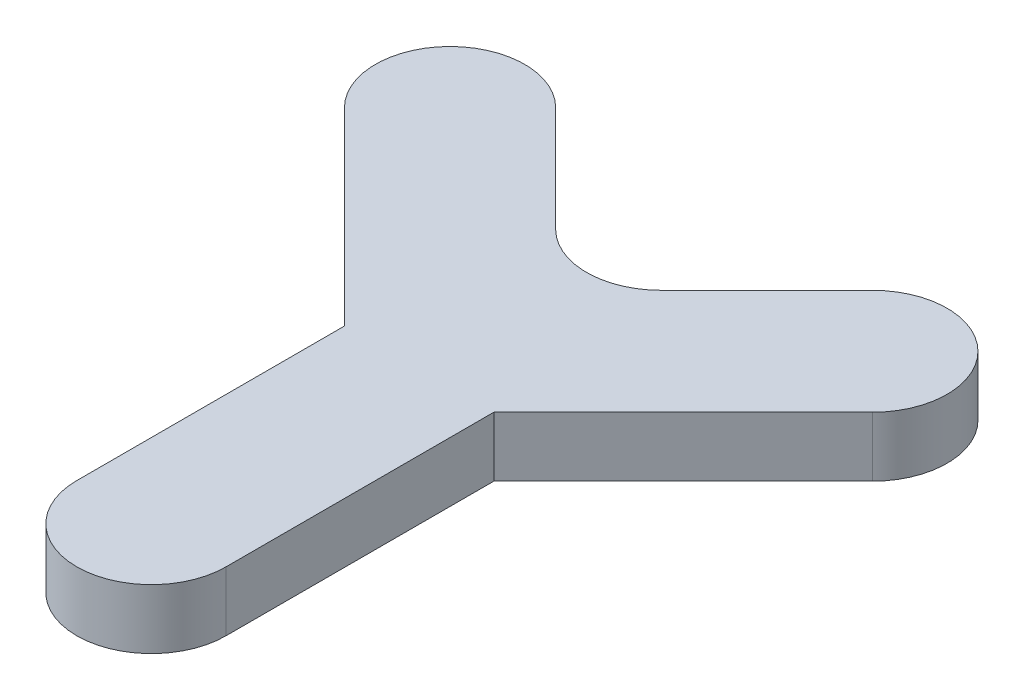
ISO-10303-21;
HEADER;
FILE_DESCRIPTION(('STEP AP214'),'2;1');
FILE_NAME('part.step','',(''),(''),'','','');
FILE_SCHEMA(('AUTOMOTIVE_DESIGN { 1 0 10303 214 1 1 1 1 }'));
ENDSEC;
DATA;
#1=APPLICATION_CONTEXT('core data for automotive mechanical design processes');
#2=APPLICATION_PROTOCOL_DEFINITION('international standard','automotive_design',2000,#1);
#3=PRODUCT_CONTEXT('',#1,'mechanical');
#4=PRODUCT('Part','Part','',(#3));
#5=PRODUCT_RELATED_PRODUCT_CATEGORY('part','',(#4));
#6=PRODUCT_DEFINITION_FORMATION('','',#4);
#7=PRODUCT_DEFINITION_CONTEXT('part definition',#1,'design');
#8=PRODUCT_DEFINITION('design','',#6,#7);
#9=PRODUCT_DEFINITION_SHAPE('','',#8);
#10=(LENGTH_UNIT() NAMED_UNIT(*) SI_UNIT(.MILLI.,.METRE.));
#11=(NAMED_UNIT(*) PLANE_ANGLE_UNIT() SI_UNIT($,.RADIAN.));
#12=(NAMED_UNIT(*) SI_UNIT($,.STERADIAN.) SOLID_ANGLE_UNIT());
#13=UNCERTAINTY_MEASURE_WITH_UNIT(LENGTH_MEASURE(1.E-05),#10,'distance_accuracy_value','');
#14=(GEOMETRIC_REPRESENTATION_CONTEXT(3) GLOBAL_UNCERTAINTY_ASSIGNED_CONTEXT((#13)) GLOBAL_UNIT_ASSIGNED_CONTEXT((#10,
#11,#12)) REPRESENTATION_CONTEXT('',''));
#15=CARTESIAN_POINT('',(0.,0.,0.));
#16=DIRECTION('',(0.,0.,1.));
#17=DIRECTION('',(1.,0.,0.));
#18=AXIS2_PLACEMENT_3D('',#15,#16,#17);
#19=CARTESIAN_POINT('',(0.,2.,-7.07106781186545));
#20=DIRECTION('',(0.,-1.,0.));
#21=DIRECTION('',(0.,0.,-1.));
#22=AXIS2_PLACEMENT_3D('',#19,#20,#21);
#23=CYLINDRICAL_SURFACE('',#22,2.5);
#24=CARTESIAN_POINT('',(0.,0.,-7.07106781186545));
#25=DIRECTION('',(0.,-1.,0.));
#26=DIRECTION('',(0.,0.,1.));
#27=AXIS2_PLACEMENT_3D('',#24,#25,#26);
#28=CIRCLE('',#27,2.5);
#29=CARTESIAN_POINT('',(1.76776695296642,0.,-5.30330085889907));
#30=VERTEX_POINT('',#29);
#31=CARTESIAN_POINT('',(-1.76776695296632,0.,-5.30330085889909));
#32=VERTEX_POINT('',#31);
#33=EDGE_CURVE('E152',#30,#32,#28,.T.);
#34=ORIENTED_EDGE('',*,*,#33,.T.);
#35=DIRECTION('',(0.,-1.,0.));
#36=VECTOR('',#35,1.);
#37=CARTESIAN_POINT('',(-1.76776695296632,2.,-5.30330085889909));
#38=LINE('',#37,#36);
#39=CARTESIAN_POINT('',(-1.76776695296632,2.,-5.30330085889909));
#40=VERTEX_POINT('',#39);
#41=EDGE_CURVE('E11',#40,#32,#38,.T.);
#42=ORIENTED_EDGE('',*,*,#41,.F.);
#43=CARTESIAN_POINT('',(0.,2.,-7.07106781186545));
#44=DIRECTION('',(0.,-1.,0.));
#45=DIRECTION('',(0.,0.,1.));
#46=AXIS2_PLACEMENT_3D('',#43,#44,#45);
#47=CIRCLE('',#46,2.5);
#48=CARTESIAN_POINT('',(1.76776695296642,2.,-5.30330085889907));
#49=VERTEX_POINT('',#48);
#50=EDGE_CURVE('E180',#49,#40,#47,.T.);
#51=ORIENTED_EDGE('',*,*,#50,.F.);
#52=DIRECTION('',(0.,-1.,0.));
#53=VECTOR('',#52,1.);
#54=CARTESIAN_POINT('',(1.76776695296642,2.,-5.30330085889907));
#55=LINE('',#54,#53);
#56=EDGE_CURVE('E148',#49,#30,#55,.T.);
#57=ORIENTED_EDGE('',*,*,#56,.T.);
#58=EDGE_LOOP('',(#34,#42,#51,#57));
#59=FACE_BOUND('',#58,.T.);
#60=ADVANCED_FACE('F39',(#59),#23,.F.);
#61=CARTESIAN_POINT('',(-5.30330085889906,2.,-8.83883476483187));
#62=DIRECTION('',(-0.707106781186551,0.,0.707106781186544));
#63=DIRECTION('',(0.707106781186544,0.,0.707106781186551));
#64=AXIS2_PLACEMENT_3D('',#61,#62,#63);
#65=PLANE('',#64);
#66=DIRECTION('',(-0.707106781186544,0.,-0.707106781186551));
#67=VECTOR('',#66,1.);
#68=CARTESIAN_POINT('',(-5.30330085889906,0.,-8.83883476483187));
#69=LINE('',#68,#67);
#70=CARTESIAN_POINT('',(-5.30330085889906,0.,-8.83883476483187));
#71=VERTEX_POINT('',#70);
#72=EDGE_CURVE('E156',#32,#71,#69,.T.);
#73=ORIENTED_EDGE('',*,*,#72,.T.);
#74=DIRECTION('',(0.,-1.,0.));
#75=VECTOR('',#74,1.);
#76=CARTESIAN_POINT('',(-5.30330085889906,2.,-8.83883476483187));
#77=LINE('',#76,#75);
#78=CARTESIAN_POINT('',(-5.30330085889906,2.,-8.83883476483187));
#79=VERTEX_POINT('',#78);
#80=EDGE_CURVE('E48',#79,#71,#77,.T.);
#81=ORIENTED_EDGE('',*,*,#80,.F.);
#82=DIRECTION('',(-0.707106781186544,0.,-0.707106781186551));
#83=VECTOR('',#82,1.);
#84=CARTESIAN_POINT('',(-5.30330085889906,2.,-8.83883476483187));
#85=LINE('',#84,#83);
#86=EDGE_CURVE('E105',#40,#79,#85,.T.);
#87=ORIENTED_EDGE('',*,*,#86,.F.);
#88=ORIENTED_EDGE('',*,*,#41,.T.);
#89=EDGE_LOOP('',(#73,#81,#87,#88));
#90=FACE_BOUND('',#89,.T.);
#91=ADVANCED_FACE('F244',(#90),#65,.F.);
#92=CARTESIAN_POINT('',(-7.07106781186544,2.,-7.07106781186551));
#93=DIRECTION('',(0.,-1.,0.));
#94=DIRECTION('',(0.,0.,-1.));
#95=AXIS2_PLACEMENT_3D('',#92,#93,#94);
#96=CYLINDRICAL_SURFACE('',#95,2.5);
#97=CARTESIAN_POINT('',(-7.07106781186544,0.,-7.07106781186551));
#98=DIRECTION('',(0.,1.,0.));
#99=DIRECTION('',(0.,0.,1.));
#100=AXIS2_PLACEMENT_3D('',#97,#98,#99);
#101=CIRCLE('',#100,2.5);
#102=CARTESIAN_POINT('',(-8.83883476483182,0.,-5.30330085889915));
#103=VERTEX_POINT('',#102);
#104=EDGE_CURVE('E159',#71,#103,#101,.T.);
#105=ORIENTED_EDGE('',*,*,#104,.T.);
#106=DIRECTION('',(0.,-1.,0.));
#107=VECTOR('',#106,1.);
#108=CARTESIAN_POINT('',(-8.83883476483182,2.,-5.30330085889915));
#109=LINE('',#108,#107);
#110=CARTESIAN_POINT('',(-8.83883476483182,2.,-5.30330085889915));
#111=VERTEX_POINT('',#110);
#112=EDGE_CURVE('E199',#111,#103,#109,.T.);
#113=ORIENTED_EDGE('',*,*,#112,.F.);
#114=CARTESIAN_POINT('',(-7.07106781186544,2.,-7.07106781186551));
#115=DIRECTION('',(0.,1.,0.));
#116=DIRECTION('',(0.,0.,1.));
#117=AXIS2_PLACEMENT_3D('',#114,#115,#116);
#118=CIRCLE('',#117,2.5);
#119=EDGE_CURVE('E209',#79,#111,#118,.T.);
#120=ORIENTED_EDGE('',*,*,#119,.F.);
#121=ORIENTED_EDGE('',*,*,#80,.T.);
#122=EDGE_LOOP('',(#105,#113,#120,#121));
#123=FACE_BOUND('',#122,.T.);
#124=ADVANCED_FACE('F207',(#123),#96,.T.);
#125=CARTESIAN_POINT('',(-2.5,2.,1.03553390593273));
#126=DIRECTION('',(0.707106781186551,0.,-0.707106781186544));
#127=DIRECTION('',(-0.707106781186544,0.,-0.707106781186551));
#128=AXIS2_PLACEMENT_3D('',#125,#126,#127);
#129=PLANE('',#128);
#130=DIRECTION('',(0.707106781186544,0.,0.707106781186551));
#131=VECTOR('',#130,1.);
#132=CARTESIAN_POINT('',(-2.5,0.,1.03553390593273));
#133=LINE('',#132,#131);
#134=CARTESIAN_POINT('',(-2.5,0.,1.03553390593273));
#135=VERTEX_POINT('',#134);
#136=EDGE_CURVE('E162',#103,#135,#133,.T.);
#137=ORIENTED_EDGE('',*,*,#136,.T.);
#138=DIRECTION('',(0.,-1.,0.));
#139=VECTOR('',#138,1.);
#140=CARTESIAN_POINT('',(-2.5,2.,1.03553390593273));
#141=LINE('',#140,#139);
#142=CARTESIAN_POINT('',(-2.5,2.,1.03553390593273));
#143=VERTEX_POINT('',#142);
#144=EDGE_CURVE('E195',#143,#135,#141,.T.);
#145=ORIENTED_EDGE('',*,*,#144,.F.);
#146=DIRECTION('',(0.707106781186544,0.,0.707106781186551));
#147=VECTOR('',#146,1.);
#148=CARTESIAN_POINT('',(-2.5,2.,1.03553390593273));
#149=LINE('',#148,#147);
#150=EDGE_CURVE('E228',#111,#143,#149,.T.);
#151=ORIENTED_EDGE('',*,*,#150,.F.);
#152=ORIENTED_EDGE('',*,*,#112,.T.);
#153=EDGE_LOOP('',(#137,#145,#151,#152));
#154=FACE_BOUND('',#153,.T.);
#155=ADVANCED_FACE('F218',(#154),#129,.F.);
#156=CARTESIAN_POINT('',(-2.5,2.,10.));
#157=DIRECTION('',(1.,0.,0.));
#158=DIRECTION('',(0.,0.,-1.));
#159=AXIS2_PLACEMENT_3D('',#156,#157,#158);
#160=PLANE('',#159);
#161=DIRECTION('',(0.,0.,1.));
#162=VECTOR('',#161,1.);
#163=CARTESIAN_POINT('',(-2.5,0.,10.));
#164=LINE('',#163,#162);
#165=CARTESIAN_POINT('',(-2.5,0.,10.));
#166=VERTEX_POINT('',#165);
#167=EDGE_CURVE('E165',#135,#166,#164,.T.);
#168=ORIENTED_EDGE('',*,*,#167,.T.);
#169=DIRECTION('',(0.,-1.,0.));
#170=VECTOR('',#169,1.);
#171=CARTESIAN_POINT('',(-2.5,2.,10.));
#172=LINE('',#171,#170);
#173=CARTESIAN_POINT('',(-2.5,2.,10.));
#174=VERTEX_POINT('',#173);
#175=EDGE_CURVE('E191',#174,#166,#172,.T.);
#176=ORIENTED_EDGE('',*,*,#175,.F.);
#177=DIRECTION('',(0.,0.,1.));
#178=VECTOR('',#177,1.);
#179=CARTESIAN_POINT('',(-2.5,2.,10.));
#180=LINE('',#179,#178);
#181=EDGE_CURVE('E224',#143,#174,#180,.T.);
#182=ORIENTED_EDGE('',*,*,#181,.F.);
#183=ORIENTED_EDGE('',*,*,#144,.T.);
#184=EDGE_LOOP('',(#168,#176,#182,#183));
#185=FACE_BOUND('',#184,.T.);
#186=ADVANCED_FACE('F222',(#185),#160,.F.);
#187=CARTESIAN_POINT('',(0.,2.,10.));
#188=DIRECTION('',(0.,-1.,0.));
#189=DIRECTION('',(0.,0.,-1.));
#190=AXIS2_PLACEMENT_3D('',#187,#188,#189);
#191=CYLINDRICAL_SURFACE('',#190,2.5);
#192=CARTESIAN_POINT('',(0.,0.,10.));
#193=DIRECTION('',(0.,1.,0.));
#194=DIRECTION('',(0.,0.,1.));
#195=AXIS2_PLACEMENT_3D('',#192,#193,#194);
#196=CIRCLE('',#195,2.5);
#197=CARTESIAN_POINT('',(2.5,0.,10.));
#198=VERTEX_POINT('',#197);
#199=EDGE_CURVE('E168',#166,#198,#196,.T.);
#200=ORIENTED_EDGE('',*,*,#199,.T.);
#201=DIRECTION('',(0.,-1.,0.));
#202=VECTOR('',#201,1.);
#203=CARTESIAN_POINT('',(2.5,2.,10.));
#204=LINE('',#203,#202);
#205=CARTESIAN_POINT('',(2.5,2.,10.));
#206=VERTEX_POINT('',#205);
#207=EDGE_CURVE('E187',#206,#198,#204,.T.);
#208=ORIENTED_EDGE('',*,*,#207,.F.);
#209=CARTESIAN_POINT('',(0.,2.,10.));
#210=DIRECTION('',(0.,1.,0.));
#211=DIRECTION('',(0.,0.,1.));
#212=AXIS2_PLACEMENT_3D('',#209,#210,#211);
#213=CIRCLE('',#212,2.5);
#214=EDGE_CURVE('E227',#174,#206,#213,.T.);
#215=ORIENTED_EDGE('',*,*,#214,.F.);
#216=ORIENTED_EDGE('',*,*,#175,.T.);
#217=EDGE_LOOP('',(#200,#208,#215,#216));
#218=FACE_BOUND('',#217,.T.);
#219=ADVANCED_FACE('F256',(#218),#191,.T.);
#220=CARTESIAN_POINT('',(2.5,2.,10.));
#221=DIRECTION('',(-1.,0.,0.));
#222=DIRECTION('',(0.,0.,1.));
#223=AXIS2_PLACEMENT_3D('',#220,#221,#222);
#224=PLANE('',#223);
#225=DIRECTION('',(0.,0.,-1.));
#226=VECTOR('',#225,1.);
#227=CARTESIAN_POINT('',(2.5,0.,10.));
#228=LINE('',#227,#226);
#229=CARTESIAN_POINT('',(2.5,0.,1.03553390593275));
#230=VERTEX_POINT('',#229);
#231=EDGE_CURVE('E171',#198,#230,#228,.T.);
#232=ORIENTED_EDGE('',*,*,#231,.T.);
#233=DIRECTION('',(0.,-1.,0.));
#234=VECTOR('',#233,1.);
#235=CARTESIAN_POINT('',(2.5,2.,1.03553390593275));
#236=LINE('',#235,#234);
#237=CARTESIAN_POINT('',(2.5,2.,1.03553390593275));
#238=VERTEX_POINT('',#237);
#239=EDGE_CURVE('E141',#238,#230,#236,.T.);
#240=ORIENTED_EDGE('',*,*,#239,.F.);
#241=DIRECTION('',(0.,0.,-1.));
#242=VECTOR('',#241,1.);
#243=CARTESIAN_POINT('',(2.5,2.,10.));
#244=LINE('',#243,#242);
#245=EDGE_CURVE('E130',#206,#238,#244,.T.);
#246=ORIENTED_EDGE('',*,*,#245,.F.);
#247=ORIENTED_EDGE('',*,*,#207,.T.);
#248=EDGE_LOOP('',(#232,#240,#246,#247));
#249=FACE_BOUND('',#248,.T.);
#250=ADVANCED_FACE('F259',(#249),#224,.F.);
#251=CARTESIAN_POINT('',(8.83883476483189,2.,-5.30330085889903));
#252=DIRECTION('',(-0.707106781186541,0.,-0.707106781186554));
#253=DIRECTION('',(-0.707106781186554,0.,0.707106781186541));
#254=AXIS2_PLACEMENT_3D('',#251,#252,#253);
#255=PLANE('',#254);
#256=DIRECTION('',(0.707106781186554,0.,-0.707106781186541));
#257=VECTOR('',#256,1.);
#258=CARTESIAN_POINT('',(8.83883476483189,0.,-5.30330085889903));
#259=LINE('',#258,#257);
#260=CARTESIAN_POINT('',(8.83883476483189,0.,-5.30330085889903));
#261=VERTEX_POINT('',#260);
#262=EDGE_CURVE('E139',#230,#261,#259,.T.);
#263=ORIENTED_EDGE('',*,*,#262,.T.);
#264=DIRECTION('',(0.,-1.,0.));
#265=VECTOR('',#264,1.);
#266=CARTESIAN_POINT('',(8.83883476483189,2.,-5.30330085889903));
#267=LINE('',#266,#265);
#268=CARTESIAN_POINT('',(8.83883476483189,2.,-5.30330085889903));
#269=VERTEX_POINT('',#268);
#270=EDGE_CURVE('E136',#269,#261,#267,.T.);
#271=ORIENTED_EDGE('',*,*,#270,.F.);
#272=DIRECTION('',(0.707106781186554,0.,-0.707106781186541));
#273=VECTOR('',#272,1.);
#274=CARTESIAN_POINT('',(8.83883476483189,2.,-5.30330085889903));
#275=LINE('',#274,#273);
#276=EDGE_CURVE('E124',#238,#269,#275,.T.);
#277=ORIENTED_EDGE('',*,*,#276,.F.);
#278=ORIENTED_EDGE('',*,*,#239,.T.);
#279=EDGE_LOOP('',(#263,#271,#277,#278));
#280=FACE_BOUND('',#279,.T.);
#281=ADVANCED_FACE('F137',(#280),#255,.F.);
#282=CARTESIAN_POINT('',(7.07106781186554,2.,-7.07106781186541));
#283=DIRECTION('',(0.,-1.,0.));
#284=DIRECTION('',(0.,0.,-1.));
#285=AXIS2_PLACEMENT_3D('',#282,#283,#284);
#286=CYLINDRICAL_SURFACE('',#285,2.5);
#287=CARTESIAN_POINT('',(7.07106781186554,0.,-7.07106781186541));
#288=DIRECTION('',(0.,1.,0.));
#289=DIRECTION('',(0.,0.,1.));
#290=AXIS2_PLACEMENT_3D('',#287,#288,#289);
#291=CIRCLE('',#290,2.5);
#292=CARTESIAN_POINT('',(5.30330085889918,0.,-8.8388347648318));
#293=VERTEX_POINT('',#292);
#294=EDGE_CURVE('E91',#261,#293,#291,.T.);
#295=ORIENTED_EDGE('',*,*,#294,.T.);
#296=DIRECTION('',(0.,-1.,0.));
#297=VECTOR('',#296,1.);
#298=CARTESIAN_POINT('',(5.30330085889918,2.,-8.8388347648318));
#299=LINE('',#298,#297);
#300=CARTESIAN_POINT('',(5.30330085889918,2.,-8.8388347648318));
#301=VERTEX_POINT('',#300);
#302=EDGE_CURVE('E142',#301,#293,#299,.T.);
#303=ORIENTED_EDGE('',*,*,#302,.F.);
#304=CARTESIAN_POINT('',(7.07106781186554,2.,-7.07106781186541));
#305=DIRECTION('',(0.,1.,0.));
#306=DIRECTION('',(0.,0.,1.));
#307=AXIS2_PLACEMENT_3D('',#304,#305,#306);
#308=CIRCLE('',#307,2.5);
#309=EDGE_CURVE('E128',#269,#301,#308,.T.);
#310=ORIENTED_EDGE('',*,*,#309,.F.);
#311=ORIENTED_EDGE('',*,*,#270,.T.);
#312=EDGE_LOOP('',(#295,#303,#310,#311));
#313=FACE_BOUND('',#312,.T.);
#314=ADVANCED_FACE('F144',(#313),#286,.T.);
#315=CARTESIAN_POINT('',(1.76776695296642,2.,-5.30330085889907));
#316=DIRECTION('',(0.707106781186544,0.,0.707106781186551));
#317=DIRECTION('',(0.707106781186551,0.,-0.707106781186544));
#318=AXIS2_PLACEMENT_3D('',#315,#316,#317);
#319=PLANE('',#318);
#320=DIRECTION('',(-0.707106781186551,0.,0.707106781186544));
#321=VECTOR('',#320,1.);
#322=CARTESIAN_POINT('',(1.76776695296642,0.,-5.30330085889907));
#323=LINE('',#322,#321);
#324=EDGE_CURVE('E97',#293,#30,#323,.T.);
#325=ORIENTED_EDGE('',*,*,#324,.T.);
#326=ORIENTED_EDGE('',*,*,#56,.F.);
#327=DIRECTION('',(-0.707106781186551,0.,0.707106781186544));
#328=VECTOR('',#327,1.);
#329=CARTESIAN_POINT('',(1.76776695296642,2.,-5.30330085889907));
#330=LINE('',#329,#328);
#331=EDGE_CURVE('E56',#301,#49,#330,.T.);
#332=ORIENTED_EDGE('',*,*,#331,.F.);
#333=ORIENTED_EDGE('',*,*,#302,.T.);
#334=EDGE_LOOP('',(#325,#326,#332,#333));
#335=FACE_BOUND('',#334,.T.);
#336=ADVANCED_FACE('F268',(#335),#319,.F.);
#337=CARTESIAN_POINT('',(0.,2.,-7.07106781186545));
#338=DIRECTION('',(0.,1.,0.));
#339=DIRECTION('',(0.,0.,1.));
#340=AXIS2_PLACEMENT_3D('',#337,#338,#339);
#341=PLANE('',#340);
#342=ORIENTED_EDGE('',*,*,#50,.T.);
#343=ORIENTED_EDGE('',*,*,#86,.T.);
#344=ORIENTED_EDGE('',*,*,#119,.T.);
#345=ORIENTED_EDGE('',*,*,#150,.T.);
#346=ORIENTED_EDGE('',*,*,#181,.T.);
#347=ORIENTED_EDGE('',*,*,#214,.T.);
#348=ORIENTED_EDGE('',*,*,#245,.T.);
#349=ORIENTED_EDGE('',*,*,#276,.T.);
#350=ORIENTED_EDGE('',*,*,#309,.T.);
#351=ORIENTED_EDGE('',*,*,#331,.T.);
#352=EDGE_LOOP('',(#342,#343,#344,#345,#346,#347,#348,#349,#350,#351));
#353=FACE_BOUND('',#352,.T.);
#354=ADVANCED_FACE('F126',(#353),#341,.T.);
#355=CARTESIAN_POINT('',(0.,0.,-7.07106781186545));
#356=DIRECTION('',(0.,1.,0.));
#357=DIRECTION('',(0.,0.,1.));
#358=AXIS2_PLACEMENT_3D('',#355,#356,#357);
#359=PLANE('',#358);
#360=ORIENTED_EDGE('',*,*,#33,.F.);
#361=ORIENTED_EDGE('',*,*,#324,.F.);
#362=ORIENTED_EDGE('',*,*,#294,.F.);
#363=ORIENTED_EDGE('',*,*,#262,.F.);
#364=ORIENTED_EDGE('',*,*,#231,.F.);
#365=ORIENTED_EDGE('',*,*,#199,.F.);
#366=ORIENTED_EDGE('',*,*,#167,.F.);
#367=ORIENTED_EDGE('',*,*,#136,.F.);
#368=ORIENTED_EDGE('',*,*,#104,.F.);
#369=ORIENTED_EDGE('',*,*,#72,.F.);
#370=EDGE_LOOP('',(#360,#361,#362,#363,#364,#365,#366,#367,#368,#369));
#371=FACE_BOUND('',#370,.T.);
#372=ADVANCED_FACE('F213',(#371),#359,.F.);
#373=CLOSED_SHELL('',(#60,#91,#124,#155,#186,#219,#250,#281,#314,#336,#354,#372));
#374=MANIFOLD_SOLID_BREP('B2',#373);
#375=ADVANCED_BREP_SHAPE_REPRESENTATION('',(#18,#374),#14);
#376=SHAPE_DEFINITION_REPRESENTATION(#9,#375);
ENDSEC;
END-ISO-10303-21;
